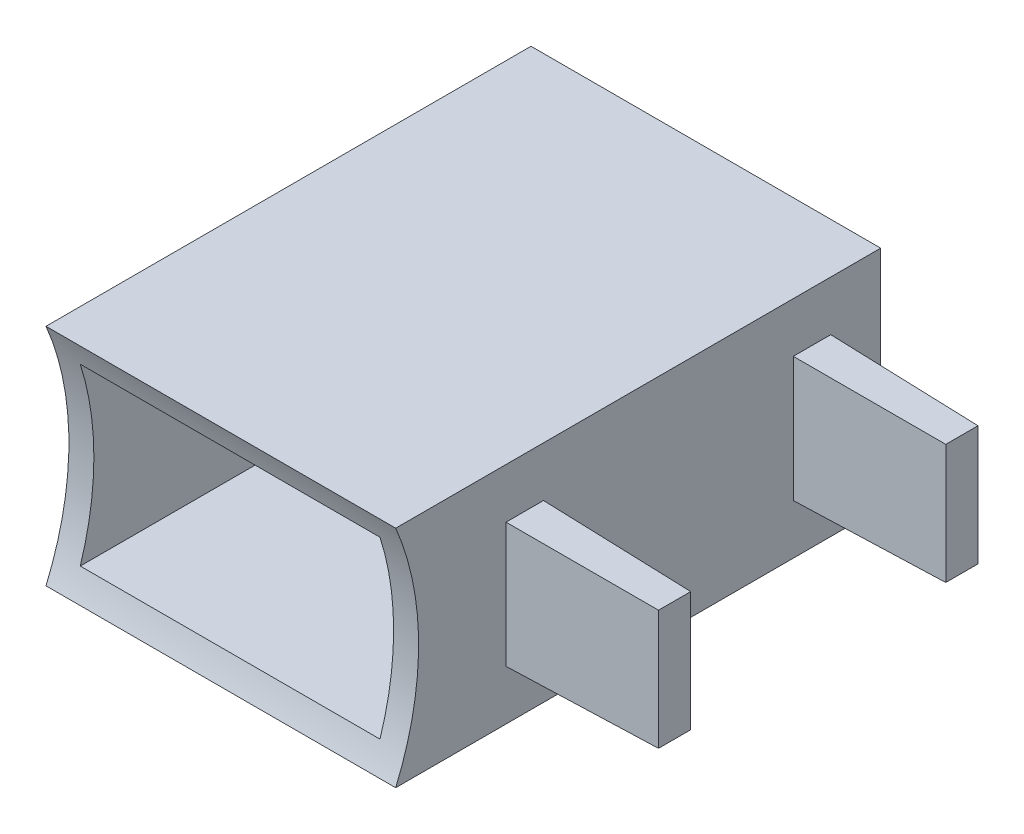
ISO-10303-21;
HEADER;
FILE_DESCRIPTION(('STEP AP214'),'2;1');
FILE_NAME('part.step','',(''),(''),'','','');
FILE_SCHEMA(('AUTOMOTIVE_DESIGN { 1 0 10303 214 1 1 1 1 }'));
ENDSEC;
DATA;
#1=APPLICATION_CONTEXT('core data for automotive mechanical design processes');
#2=APPLICATION_PROTOCOL_DEFINITION('international standard','automotive_design',2000,#1);
#3=PRODUCT_CONTEXT('',#1,'mechanical');
#4=PRODUCT('Part','Part','',(#3));
#5=PRODUCT_RELATED_PRODUCT_CATEGORY('part','',(#4));
#6=PRODUCT_DEFINITION_FORMATION('','',#4);
#7=PRODUCT_DEFINITION_CONTEXT('part definition',#1,'design');
#8=PRODUCT_DEFINITION('design','',#6,#7);
#9=PRODUCT_DEFINITION_SHAPE('','',#8);
#10=(LENGTH_UNIT() NAMED_UNIT(*) SI_UNIT(.MILLI.,.METRE.));
#11=(NAMED_UNIT(*) PLANE_ANGLE_UNIT() SI_UNIT($,.RADIAN.));
#12=(NAMED_UNIT(*) SI_UNIT($,.STERADIAN.) SOLID_ANGLE_UNIT());
#13=UNCERTAINTY_MEASURE_WITH_UNIT(LENGTH_MEASURE(1.E-05),#10,'distance_accuracy_value','');
#14=(GEOMETRIC_REPRESENTATION_CONTEXT(3) GLOBAL_UNCERTAINTY_ASSIGNED_CONTEXT((#13)) GLOBAL_UNIT_ASSIGNED_CONTEXT((#10,
#11,#12)) REPRESENTATION_CONTEXT('',''));
#15=CARTESIAN_POINT('',(0.,0.,0.));
#16=DIRECTION('',(0.,0.,1.));
#17=DIRECTION('',(1.,0.,0.));
#18=AXIS2_PLACEMENT_3D('',#15,#16,#17);
#19=CARTESIAN_POINT('',(7.,16.7915026221292,-4.70849737787081));
#20=DIRECTION('',(-1.,0.,0.));
#21=DIRECTION('',(0.,1.,0.));
#22=AXIS2_PLACEMENT_3D('',#19,#20,#21);
#23=PLANE('',#22);
#24=DIRECTION('',(0.,0.,-1.));
#25=VECTOR('',#24,1.);
#26=CARTESIAN_POINT('',(7.,17.7915026221292,-7.70849737787081));
#27=LINE('',#26,#25);
#28=CARTESIAN_POINT('',(7.,17.7915026221292,-6.20849737787081));
#29=VERTEX_POINT('',#28);
#30=CARTESIAN_POINT('',(7.,17.7915026221292,-7.70849737787081));
#31=VERTEX_POINT('',#30);
#32=EDGE_CURVE('E221',#29,#31,#27,.T.);
#33=ORIENTED_EDGE('',*,*,#32,.F.);
#34=DIRECTION('',(0.,-1.,0.));
#35=VECTOR('',#34,1.);
#36=CARTESIAN_POINT('',(7.,22.7915026221292,-6.20849737787083));
#37=LINE('',#36,#35);
#38=CARTESIAN_POINT('',(7.,22.7915026221292,-6.20849737787083));
#39=VERTEX_POINT('',#38);
#40=EDGE_CURVE('E233',#39,#29,#37,.T.);
#41=ORIENTED_EDGE('',*,*,#40,.F.);
#42=DIRECTION('',(0.,0.,1.));
#43=VECTOR('',#42,1.);
#44=CARTESIAN_POINT('',(7.,22.7915026221292,-7.70849737787083));
#45=LINE('',#44,#43);
#46=CARTESIAN_POINT('',(7.,22.7915026221292,-7.70849737787083));
#47=VERTEX_POINT('',#46);
#48=EDGE_CURVE('E229',#47,#39,#45,.T.);
#49=ORIENTED_EDGE('',*,*,#48,.F.);
#50=DIRECTION('',(0.,1.,0.));
#51=VECTOR('',#50,1.);
#52=CARTESIAN_POINT('',(7.,22.7915026221292,-7.70849737787083));
#53=LINE('',#52,#51);
#54=EDGE_CURVE('E225',#31,#47,#53,.T.);
#55=ORIENTED_EDGE('',*,*,#54,.F.);
#56=EDGE_LOOP('',(#33,#41,#49,#55));
#57=FACE_BOUND('',#56,.T.);
#58=DIRECTION('',(0.,0.,1.));
#59=VECTOR('',#58,1.);
#60=CARTESIAN_POINT('',(7.,24.7915026221292,-4.70849737787084));
#61=LINE('',#60,#59);
#62=CARTESIAN_POINT('',(7.,24.7915026221291,-9.70849737787084));
#63=VERTEX_POINT('',#62);
#64=CARTESIAN_POINT('',(7.,24.7915026221292,9.70849737787081));
#65=VERTEX_POINT('',#64);
#66=EDGE_CURVE('E323',#63,#65,#61,.T.);
#67=ORIENTED_EDGE('',*,*,#66,.T.);
#68=CARTESIAN_POINT('',(7.,20.2915026221293,20.2915026221292));
#69=DIRECTION('',(1.,0.,0.));
#70=DIRECTION('',(0.,-1.,0.));
#71=AXIS2_PLACEMENT_3D('',#68,#69,#70);
#72=CIRCLE('',#71,11.5);
#73=CARTESIAN_POINT('',(7.,15.7915026221292,9.70849737787084));
#74=VERTEX_POINT('',#73);
#75=EDGE_CURVE('E289',#74,#65,#72,.T.);
#76=ORIENTED_EDGE('',*,*,#75,.F.);
#77=DIRECTION('',(0.,0.,1.));
#78=VECTOR('',#77,1.);
#79=CARTESIAN_POINT('',(7.,15.7915026221292,-4.7084973778708));
#80=LINE('',#79,#78);
#81=CARTESIAN_POINT('',(7.,15.7915026221291,-9.7084973778708));
#82=VERTEX_POINT('',#81);
#83=EDGE_CURVE('E324',#82,#74,#80,.T.);
#84=ORIENTED_EDGE('',*,*,#83,.F.);
#85=DIRECTION('',(0.,-1.,0.));
#86=VECTOR('',#85,1.);
#87=CARTESIAN_POINT('',(7.,15.7915026221291,-9.7084973778708));
#88=LINE('',#87,#86);
#89=EDGE_CURVE('E267',#63,#82,#88,.T.);
#90=ORIENTED_EDGE('',*,*,#89,.F.);
#91=EDGE_LOOP('',(#67,#76,#84,#90));
#92=FACE_BOUND('',#91,.T.);
#93=DIRECTION('',(0.,0.,-1.));
#94=VECTOR('',#93,1.);
#95=CARTESIAN_POINT('',(7.,17.7915026221292,3.79150262212919));
#96=LINE('',#95,#94);
#97=CARTESIAN_POINT('',(7.,17.7915026221292,5.29150262212919));
#98=VERTEX_POINT('',#97);
#99=CARTESIAN_POINT('',(7.,17.7915026221292,3.79150262212919));
#100=VERTEX_POINT('',#99);
#101=EDGE_CURVE('E218',#98,#100,#96,.T.);
#102=ORIENTED_EDGE('',*,*,#101,.F.);
#103=DIRECTION('',(0.,-1.,0.));
#104=VECTOR('',#103,1.);
#105=CARTESIAN_POINT('',(7.,22.7915026221292,5.29150262212917));
#106=LINE('',#105,#104);
#107=CARTESIAN_POINT('',(7.,22.7915026221292,5.29150262212917));
#108=VERTEX_POINT('',#107);
#109=EDGE_CURVE('E189',#108,#98,#106,.T.);
#110=ORIENTED_EDGE('',*,*,#109,.F.);
#111=DIRECTION('',(0.,0.,1.));
#112=VECTOR('',#111,1.);
#113=CARTESIAN_POINT('',(7.,22.7915026221292,3.79150262212917));
#114=LINE('',#113,#112);
#115=CARTESIAN_POINT('',(7.,22.7915026221292,3.79150262212917));
#116=VERTEX_POINT('',#115);
#117=EDGE_CURVE('E70',#116,#108,#114,.T.);
#118=ORIENTED_EDGE('',*,*,#117,.F.);
#119=DIRECTION('',(0.,1.,0.));
#120=VECTOR('',#119,1.);
#121=CARTESIAN_POINT('',(7.,22.7915026221292,3.79150262212917));
#122=LINE('',#121,#120);
#123=EDGE_CURVE('E65',#100,#116,#122,.T.);
#124=ORIENTED_EDGE('',*,*,#123,.F.);
#125=EDGE_LOOP('',(#102,#110,#118,#124));
#126=FACE_BOUND('',#125,.T.);
#127=ADVANCED_FACE('F46',(#57,#92,#126),#23,.F.);
#128=CARTESIAN_POINT('',(-6.,15.7915026221292,-4.7084973778708));
#129=DIRECTION('',(0.,1.,0.));
#130=DIRECTION('',(1.,0.,0.));
#131=AXIS2_PLACEMENT_3D('',#128,#129,#130);
#132=PLANE('',#131);
#133=ORIENTED_EDGE('',*,*,#83,.T.);
#134=DIRECTION('',(1.,0.,0.));
#135=VECTOR('',#134,1.);
#136=CARTESIAN_POINT('',(-7.001,15.7915026221292,9.70849737787084));
#137=LINE('',#136,#135);
#138=CARTESIAN_POINT('',(-7.,15.7915026221292,9.70849737787084));
#139=VERTEX_POINT('',#138);
#140=EDGE_CURVE('E286',#139,#74,#137,.T.);
#141=ORIENTED_EDGE('',*,*,#140,.F.);
#142=DIRECTION('',(0.,0.,1.));
#143=VECTOR('',#142,1.);
#144=CARTESIAN_POINT('',(-7.,15.7915026221292,-4.7084973778708));
#145=LINE('',#144,#143);
#146=CARTESIAN_POINT('',(-7.,15.7915026221291,-9.7084973778708));
#147=VERTEX_POINT('',#146);
#148=EDGE_CURVE('E329',#147,#139,#145,.T.);
#149=ORIENTED_EDGE('',*,*,#148,.F.);
#150=DIRECTION('',(-1.,0.,0.));
#151=VECTOR('',#150,1.);
#152=CARTESIAN_POINT('',(-7.,15.7915026221291,-9.7084973778708));
#153=LINE('',#152,#151);
#154=EDGE_CURVE('E271',#82,#147,#153,.T.);
#155=ORIENTED_EDGE('',*,*,#154,.F.);
#156=EDGE_LOOP('',(#133,#141,#149,#155));
#157=FACE_BOUND('',#156,.T.);
#158=ADVANCED_FACE('F421',(#157),#132,.F.);
#159=CARTESIAN_POINT('',(-7.,16.7915026221292,-4.70849737787081));
#160=DIRECTION('',(1.,0.,0.));
#161=DIRECTION('',(0.,-1.,0.));
#162=AXIS2_PLACEMENT_3D('',#159,#160,#161);
#163=PLANE('',#162);
#164=ORIENTED_EDGE('',*,*,#148,.T.);
#165=CARTESIAN_POINT('',(-6.99999999999999,20.2915026221293,20.2915026221292));
#166=DIRECTION('',(1.,0.,0.));
#167=DIRECTION('',(0.,-1.,0.));
#168=AXIS2_PLACEMENT_3D('',#165,#166,#167);
#169=CIRCLE('',#168,11.5);
#170=CARTESIAN_POINT('',(-6.99999999999999,24.7915026221292,9.70849737787081));
#171=VERTEX_POINT('',#170);
#172=EDGE_CURVE('E308',#171,#139,#169,.F.);
#173=ORIENTED_EDGE('',*,*,#172,.F.);
#174=DIRECTION('',(0.,0.,1.));
#175=VECTOR('',#174,1.);
#176=CARTESIAN_POINT('',(-6.99999999999999,24.7915026221292,-4.70849737787084));
#177=LINE('',#176,#175);
#178=CARTESIAN_POINT('',(-7.,24.7915026221291,-9.70849737787084));
#179=VERTEX_POINT('',#178);
#180=EDGE_CURVE('E333',#179,#171,#177,.T.);
#181=ORIENTED_EDGE('',*,*,#180,.F.);
#182=DIRECTION('',(0.,1.,0.));
#183=VECTOR('',#182,1.);
#184=CARTESIAN_POINT('',(-7.,15.7915026221291,-9.7084973778708));
#185=LINE('',#184,#183);
#186=EDGE_CURVE('E275',#147,#179,#185,.T.);
#187=ORIENTED_EDGE('',*,*,#186,.F.);
#188=EDGE_LOOP('',(#164,#173,#181,#187));
#189=FACE_BOUND('',#188,.T.);
#190=ADVANCED_FACE('F427',(#189),#163,.F.);
#191=CARTESIAN_POINT('',(-5.99999999999999,24.7915026221292,-4.70849737787084));
#192=DIRECTION('',(0.,-1.,0.));
#193=DIRECTION('',(-1.,0.,0.));
#194=AXIS2_PLACEMENT_3D('',#191,#192,#193);
#195=PLANE('',#194);
#196=ORIENTED_EDGE('',*,*,#180,.T.);
#197=DIRECTION('',(1.,0.,0.));
#198=VECTOR('',#197,1.);
#199=CARTESIAN_POINT('',(-7.001,24.7915026221292,9.70849737787081));
#200=LINE('',#199,#198);
#201=EDGE_CURVE('E283',#65,#171,#200,.F.);
#202=ORIENTED_EDGE('',*,*,#201,.F.);
#203=ORIENTED_EDGE('',*,*,#66,.F.);
#204=DIRECTION('',(1.,0.,0.));
#205=VECTOR('',#204,1.);
#206=CARTESIAN_POINT('',(-7.,24.7915026221291,-9.70849737787084));
#207=LINE('',#206,#205);
#208=EDGE_CURVE('E279',#179,#63,#207,.T.);
#209=ORIENTED_EDGE('',*,*,#208,.F.);
#210=EDGE_LOOP('',(#196,#202,#203,#209));
#211=FACE_BOUND('',#210,.T.);
#212=ADVANCED_FACE('F418',(#211),#195,.F.);
#213=CARTESIAN_POINT('',(6.,16.7915026221292,-4.70849737787081));
#214=DIRECTION('',(-1.,0.,0.));
#215=DIRECTION('',(0.,1.,0.));
#216=AXIS2_PLACEMENT_3D('',#213,#214,#215);
#217=PLANE('',#216);
#218=DIRECTION('',(0.,0.,1.));
#219=VECTOR('',#218,1.);
#220=CARTESIAN_POINT('',(6.,23.7915026221292,-4.70849737787083));
#221=LINE('',#220,#219);
#222=CARTESIAN_POINT('',(6.,23.7915026221292,-8.8424719740864));
#223=VERTEX_POINT('',#222);
#224=CARTESIAN_POINT('',(6.,23.7915026221292,9.33705147202585));
#225=VERTEX_POINT('',#224);
#226=EDGE_CURVE('E311',#223,#225,#221,.T.);
#227=ORIENTED_EDGE('',*,*,#226,.F.);
#228=DIRECTION('',(0.,-1.,0.));
#229=VECTOR('',#228,1.);
#230=CARTESIAN_POINT('',(6.,16.7915026221292,-8.84247197408637));
#231=LINE('',#230,#229);
#232=CARTESIAN_POINT('',(6.,16.7915026221292,-8.84247197408637));
#233=VERTEX_POINT('',#232);
#234=EDGE_CURVE('E57',#223,#233,#231,.T.);
#235=ORIENTED_EDGE('',*,*,#234,.T.);
#236=DIRECTION('',(0.,0.,1.));
#237=VECTOR('',#236,1.);
#238=CARTESIAN_POINT('',(6.,16.7915026221292,-4.70849737787081));
#239=LINE('',#238,#237);
#240=CARTESIAN_POINT('',(6.,16.7915026221292,9.33705147202587));
#241=VERTEX_POINT('',#240);
#242=EDGE_CURVE('E320',#233,#241,#239,.T.);
#243=ORIENTED_EDGE('',*,*,#242,.T.);
#244=CARTESIAN_POINT('',(6.,20.2915026221293,20.2915026221292));
#245=DIRECTION('',(-1.,0.,0.));
#246=DIRECTION('',(0.,1.,0.));
#247=AXIS2_PLACEMENT_3D('',#244,#245,#246);
#248=CIRCLE('',#247,11.5);
#249=EDGE_CURVE('E304',#241,#225,#248,.F.);
#250=ORIENTED_EDGE('',*,*,#249,.T.);
#251=EDGE_LOOP('',(#227,#235,#243,#250));
#252=FACE_BOUND('',#251,.T.);
#253=ADVANCED_FACE('F407',(#252),#217,.T.);
#254=CARTESIAN_POINT('',(-6.,16.7915026221292,-4.70849737787081));
#255=DIRECTION('',(0.,1.,0.));
#256=DIRECTION('',(1.,0.,0.));
#257=AXIS2_PLACEMENT_3D('',#254,#255,#256);
#258=PLANE('',#257);
#259=ORIENTED_EDGE('',*,*,#242,.F.);
#260=DIRECTION('',(-1.,0.,0.));
#261=VECTOR('',#260,1.);
#262=CARTESIAN_POINT('',(-6.,16.7915026221292,-8.84247197408637));
#263=LINE('',#262,#261);
#264=CARTESIAN_POINT('',(-6.,16.7915026221292,-8.84247197408637));
#265=VERTEX_POINT('',#264);
#266=EDGE_CURVE('E11',#233,#265,#263,.T.);
#267=ORIENTED_EDGE('',*,*,#266,.T.);
#268=DIRECTION('',(0.,0.,1.));
#269=VECTOR('',#268,1.);
#270=CARTESIAN_POINT('',(-6.,16.7915026221292,-4.70849737787081));
#271=LINE('',#270,#269);
#272=CARTESIAN_POINT('',(-6.,16.7915026221292,9.33705147202588));
#273=VERTEX_POINT('',#272);
#274=EDGE_CURVE('E317',#265,#273,#271,.T.);
#275=ORIENTED_EDGE('',*,*,#274,.T.);
#276=DIRECTION('',(1.,0.,0.));
#277=VECTOR('',#276,1.);
#278=CARTESIAN_POINT('',(-7.001,16.7915026221292,9.33705147202587));
#279=LINE('',#278,#277);
#280=EDGE_CURVE('E300',#273,#241,#279,.T.);
#281=ORIENTED_EDGE('',*,*,#280,.T.);
#282=EDGE_LOOP('',(#259,#267,#275,#281));
#283=FACE_BOUND('',#282,.T.);
#284=ADVANCED_FACE('F410',(#283),#258,.T.);
#285=CARTESIAN_POINT('',(-6.,16.7915026221292,-4.70849737787081));
#286=DIRECTION('',(1.,0.,0.));
#287=DIRECTION('',(0.,-1.,0.));
#288=AXIS2_PLACEMENT_3D('',#285,#286,#287);
#289=PLANE('',#288);
#290=ORIENTED_EDGE('',*,*,#274,.F.);
#291=DIRECTION('',(0.,1.,0.));
#292=VECTOR('',#291,1.);
#293=CARTESIAN_POINT('',(-6.,16.7915026221292,-8.84247197408637));
#294=LINE('',#293,#292);
#295=CARTESIAN_POINT('',(-5.99999999999999,23.7915026221292,-8.8424719740864));
#296=VERTEX_POINT('',#295);
#297=EDGE_CURVE('E328',#265,#296,#294,.T.);
#298=ORIENTED_EDGE('',*,*,#297,.T.);
#299=DIRECTION('',(0.,0.,1.));
#300=VECTOR('',#299,1.);
#301=CARTESIAN_POINT('',(-5.99999999999999,23.7915026221292,-4.70849737787083));
#302=LINE('',#301,#300);
#303=CARTESIAN_POINT('',(-5.99999999999999,23.7915026221292,9.33705147202585));
#304=VERTEX_POINT('',#303);
#305=EDGE_CURVE('E314',#296,#304,#302,.T.);
#306=ORIENTED_EDGE('',*,*,#305,.T.);
#307=CARTESIAN_POINT('',(-6.,20.2915026221293,20.2915026221292));
#308=DIRECTION('',(1.,0.,0.));
#309=DIRECTION('',(0.,-1.,0.));
#310=AXIS2_PLACEMENT_3D('',#307,#308,#309);
#311=CIRCLE('',#310,11.5);
#312=EDGE_CURVE('E296',#304,#273,#311,.F.);
#313=ORIENTED_EDGE('',*,*,#312,.T.);
#314=EDGE_LOOP('',(#290,#298,#306,#313));
#315=FACE_BOUND('',#314,.T.);
#316=ADVANCED_FACE('F397',(#315),#289,.T.);
#317=CARTESIAN_POINT('',(-5.99999999999999,23.7915026221292,-4.70849737787083));
#318=DIRECTION('',(0.,-1.,0.));
#319=DIRECTION('',(-1.,0.,0.));
#320=AXIS2_PLACEMENT_3D('',#317,#318,#319);
#321=PLANE('',#320);
#322=ORIENTED_EDGE('',*,*,#305,.F.);
#323=DIRECTION('',(1.,0.,0.));
#324=VECTOR('',#323,1.);
#325=CARTESIAN_POINT('',(-5.99999999999999,23.7915026221292,-8.8424719740864));
#326=LINE('',#325,#324);
#327=EDGE_CURVE('E356',#296,#223,#326,.T.);
#328=ORIENTED_EDGE('',*,*,#327,.T.);
#329=ORIENTED_EDGE('',*,*,#226,.T.);
#330=DIRECTION('',(1.,0.,0.));
#331=VECTOR('',#330,1.);
#332=CARTESIAN_POINT('',(-7.001,23.7915026221292,9.33705147202585));
#333=LINE('',#332,#331);
#334=EDGE_CURVE('E292',#225,#304,#333,.F.);
#335=ORIENTED_EDGE('',*,*,#334,.T.);
#336=EDGE_LOOP('',(#322,#328,#329,#335));
#337=FACE_BOUND('',#336,.T.);
#338=ADVANCED_FACE('F399',(#337),#321,.T.);
#339=CARTESIAN_POINT('',(-7.001,20.2915026221293,20.2915026221292));
#340=DIRECTION('',(1.,0.,0.));
#341=DIRECTION('',(0.,-1.,0.));
#342=AXIS2_PLACEMENT_3D('',#339,#340,#341);
#343=CYLINDRICAL_SURFACE('',#342,11.5);
#344=ORIENTED_EDGE('',*,*,#280,.F.);
#345=ORIENTED_EDGE('',*,*,#312,.F.);
#346=ORIENTED_EDGE('',*,*,#334,.F.);
#347=ORIENTED_EDGE('',*,*,#249,.F.);
#348=EDGE_LOOP('',(#344,#345,#346,#347));
#349=FACE_BOUND('',#348,.T.);
#350=ORIENTED_EDGE('',*,*,#140,.T.);
#351=ORIENTED_EDGE('',*,*,#75,.T.);
#352=ORIENTED_EDGE('',*,*,#201,.T.);
#353=ORIENTED_EDGE('',*,*,#172,.T.);
#354=EDGE_LOOP('',(#350,#351,#352,#353));
#355=FACE_BOUND('',#354,.T.);
#356=ADVANCED_FACE('F404',(#349,#355),#343,.F.);
#357=CARTESIAN_POINT('',(0.,20.2915026221292,-9.70849737787082));
#358=DIRECTION('',(0.,0.,-1.));
#359=DIRECTION('',(0.,1.,0.));
#360=AXIS2_PLACEMENT_3D('',#357,#358,#359);
#361=PLANE('',#360);
#362=DIRECTION('',(-1.,0.,0.));
#363=VECTOR('',#362,1.);
#364=CARTESIAN_POINT('',(0.,24.2915026221292,-9.70849737787083));
#365=LINE('',#364,#363);
#366=CARTESIAN_POINT('',(6.5,24.2915026221292,-9.70849737787083));
#367=VERTEX_POINT('',#366);
#368=CARTESIAN_POINT('',(-6.5,24.2915026221292,-9.70849737787083));
#369=VERTEX_POINT('',#368);
#370=EDGE_CURVE('E349',#367,#369,#365,.T.);
#371=ORIENTED_EDGE('',*,*,#370,.T.);
#372=DIRECTION('',(0.,-1.,0.));
#373=VECTOR('',#372,1.);
#374=CARTESIAN_POINT('',(-6.5,20.2915026221292,-9.70849737787082));
#375=LINE('',#374,#373);
#376=CARTESIAN_POINT('',(-6.5,16.2915026221291,-9.70849737787081));
#377=VERTEX_POINT('',#376);
#378=EDGE_CURVE('E352',#369,#377,#375,.T.);
#379=ORIENTED_EDGE('',*,*,#378,.T.);
#380=DIRECTION('',(1.,0.,0.));
#381=VECTOR('',#380,1.);
#382=CARTESIAN_POINT('',(0.,16.2915026221291,-9.70849737787081));
#383=LINE('',#382,#381);
#384=CARTESIAN_POINT('',(6.5,16.2915026221291,-9.70849737787081));
#385=VERTEX_POINT('',#384);
#386=EDGE_CURVE('E343',#377,#385,#383,.T.);
#387=ORIENTED_EDGE('',*,*,#386,.T.);
#388=DIRECTION('',(0.,1.,0.));
#389=VECTOR('',#388,1.);
#390=CARTESIAN_POINT('',(6.5,20.2915026221292,-9.70849737787082));
#391=LINE('',#390,#389);
#392=EDGE_CURVE('E346',#385,#367,#391,.T.);
#393=ORIENTED_EDGE('',*,*,#392,.T.);
#394=EDGE_LOOP('',(#371,#379,#387,#393));
#395=FACE_BOUND('',#394,.T.);
#396=ORIENTED_EDGE('',*,*,#89,.T.);
#397=ORIENTED_EDGE('',*,*,#154,.T.);
#398=ORIENTED_EDGE('',*,*,#186,.T.);
#399=ORIENTED_EDGE('',*,*,#208,.T.);
#400=EDGE_LOOP('',(#396,#397,#398,#399));
#401=FACE_BOUND('',#400,.T.);
#402=ADVANCED_FACE('F384',(#395,#401),#361,.T.);
#403=CARTESIAN_POINT('',(6.,16.7915026221292,-8.84247197408637));
#404=DIRECTION('',(0.866025403784437,0.,0.500000000000003));
#405=DIRECTION('',(0.,-1.,0.));
#406=AXIS2_PLACEMENT_3D('',#403,#404,#405);
#407=PLANE('',#406);
#408=DIRECTION('',(0.44721359549996,0.447213595499957,-0.774596669241483));
#409=VECTOR('',#408,1.);
#410=CARTESIAN_POINT('',(3.59999999999998,21.3915026221291,-4.68555003592108));
#411=LINE('',#410,#409);
#412=EDGE_CURVE('E365',#367,#223,#411,.F.);
#413=ORIENTED_EDGE('',*,*,#412,.F.);
#414=ORIENTED_EDGE('',*,*,#392,.F.);
#415=DIRECTION('',(0.44721359549996,-0.447213595499963,-0.77459666924148));
#416=VECTOR('',#415,1.);
#417=CARTESIAN_POINT('',(6.,16.7915026221292,-8.84247197408637));
#418=LINE('',#417,#416);
#419=EDGE_CURVE('E51',#233,#385,#418,.T.);
#420=ORIENTED_EDGE('',*,*,#419,.F.);
#421=ORIENTED_EDGE('',*,*,#234,.F.);
#422=EDGE_LOOP('',(#413,#414,#420,#421));
#423=FACE_BOUND('',#422,.T.);
#424=ADVANCED_FACE('F49',(#423),#407,.F.);
#425=CARTESIAN_POINT('',(-6.,16.7915026221292,-8.84247197408637));
#426=DIRECTION('',(0.,-0.866025403784435,0.500000000000006));
#427=DIRECTION('',(-1.,0.,0.));
#428=AXIS2_PLACEMENT_3D('',#425,#426,#427);
#429=PLANE('',#428);
#430=ORIENTED_EDGE('',*,*,#419,.T.);
#431=ORIENTED_EDGE('',*,*,#386,.F.);
#432=DIRECTION('',(0.44721359549996,0.447213595499963,0.77459666924148));
#433=VECTOR('',#432,1.);
#434=CARTESIAN_POINT('',(-6.,16.7915026221292,-8.84247197408637));
#435=LINE('',#434,#433);
#436=EDGE_CURVE('E363',#265,#377,#435,.F.);
#437=ORIENTED_EDGE('',*,*,#436,.F.);
#438=ORIENTED_EDGE('',*,*,#266,.F.);
#439=EDGE_LOOP('',(#430,#431,#437,#438));
#440=FACE_BOUND('',#439,.T.);
#441=ADVANCED_FACE('F378',(#440),#429,.F.);
#442=CARTESIAN_POINT('',(-5.99999999999999,23.7915026221292,-8.8424719740864));
#443=DIRECTION('',(0.,0.866025403784439,0.5));
#444=DIRECTION('',(1.,0.,0.));
#445=AXIS2_PLACEMENT_3D('',#442,#443,#444);
#446=PLANE('',#445);
#447=ORIENTED_EDGE('',*,*,#412,.T.);
#448=ORIENTED_EDGE('',*,*,#327,.F.);
#449=DIRECTION('',(-0.44721359549996,0.447213595499957,-0.774596669241483));
#450=VECTOR('',#449,1.);
#451=CARTESIAN_POINT('',(-4.59999999999998,22.3915026221291,-6.41760084348996));
#452=LINE('',#451,#450);
#453=EDGE_CURVE('E242',#369,#296,#452,.F.);
#454=ORIENTED_EDGE('',*,*,#453,.F.);
#455=ORIENTED_EDGE('',*,*,#370,.F.);
#456=EDGE_LOOP('',(#447,#448,#454,#455));
#457=FACE_BOUND('',#456,.T.);
#458=ADVANCED_FACE('F391',(#457),#446,.F.);
#459=CARTESIAN_POINT('',(-6.,16.7915026221292,-8.84247197408637));
#460=DIRECTION('',(-0.866025403784437,0.,0.500000000000003));
#461=DIRECTION('',(0.,1.,0.));
#462=AXIS2_PLACEMENT_3D('',#459,#460,#461);
#463=PLANE('',#462);
#464=ORIENTED_EDGE('',*,*,#436,.T.);
#465=ORIENTED_EDGE('',*,*,#378,.F.);
#466=ORIENTED_EDGE('',*,*,#453,.T.);
#467=ORIENTED_EDGE('',*,*,#297,.F.);
#468=EDGE_LOOP('',(#464,#465,#466,#467));
#469=FACE_BOUND('',#468,.T.);
#470=ADVANCED_FACE('F389',(#469),#463,.F.);
#471=CARTESIAN_POINT('',(7.,17.7915026221292,-7.70849737787081));
#472=DIRECTION('',(0.0174524064372838,-0.999847695156391,0.));
#473=DIRECTION('',(-0.999847695156391,-0.0174524064372838,0.));
#474=AXIS2_PLACEMENT_3D('',#471,#472,#473);
#475=PLANE('',#474);
#476=ORIENTED_EDGE('',*,*,#32,.T.);
#477=DIRECTION('',(-0.999695459881887,-0.017449749160683,-0.0174497491606827));
#478=VECTOR('',#477,1.);
#479=CARTESIAN_POINT('',(7.08722217506006,17.793025090858,-7.70697490914196));
#480=LINE('',#479,#478);
#481=CARTESIAN_POINT('',(13.,17.8962330116985,-7.60376698830151));
#482=VERTEX_POINT('',#481);
#483=EDGE_CURVE('E238',#482,#31,#480,.T.);
#484=ORIENTED_EDGE('',*,*,#483,.F.);
#485=DIRECTION('',(0.,0.,1.));
#486=VECTOR('',#485,1.);
#487=CARTESIAN_POINT('',(13.,17.8962330116985,-7.70849737787082));
#488=LINE('',#487,#486);
#489=CARTESIAN_POINT('',(13.,17.8962330116985,-6.31322776744012));
#490=VERTEX_POINT('',#489);
#491=EDGE_CURVE('E237',#490,#482,#488,.F.);
#492=ORIENTED_EDGE('',*,*,#491,.F.);
#493=DIRECTION('',(-0.999695459881887,-0.0174497491606829,0.0174497491606828));
#494=VECTOR('',#493,1.);
#495=CARTESIAN_POINT('',(7.02616665251802,17.7919593627478,-6.20895411848947));
#496=LINE('',#495,#494);
#497=EDGE_CURVE('E244',#490,#29,#496,.T.);
#498=ORIENTED_EDGE('',*,*,#497,.T.);
#499=EDGE_LOOP('',(#476,#484,#492,#498));
#500=FACE_BOUND('',#499,.T.);
#501=ADVANCED_FACE('F444',(#500),#475,.T.);
#502=CARTESIAN_POINT('',(7.,22.7915026221292,-7.70849737787083));
#503=DIRECTION('',(0.0174524064372835,0.,-0.999847695156391));
#504=DIRECTION('',(-0.999847695156391,0.,-0.0174524064372835));
#505=AXIS2_PLACEMENT_3D('',#502,#503,#504);
#506=PLANE('',#505);
#507=ORIENTED_EDGE('',*,*,#54,.T.);
#508=DIRECTION('',(-0.999695459881887,0.0174497491606824,-0.0174497491606828));
#509=VECTOR('',#508,1.);
#510=CARTESIAN_POINT('',(7.,22.7915026221292,-7.70849737787083));
#511=LINE('',#510,#509);
#512=CARTESIAN_POINT('',(13.,22.6867722325599,-7.60376698830153));
#513=VERTEX_POINT('',#512);
#514=EDGE_CURVE('E243',#513,#47,#511,.T.);
#515=ORIENTED_EDGE('',*,*,#514,.F.);
#516=DIRECTION('',(0.,-1.,0.));
#517=VECTOR('',#516,1.);
#518=CARTESIAN_POINT('',(13.,22.7915026221292,-7.60376698830153));
#519=LINE('',#518,#517);
#520=EDGE_CURVE('E259',#482,#513,#519,.F.);
#521=ORIENTED_EDGE('',*,*,#520,.F.);
#522=ORIENTED_EDGE('',*,*,#483,.T.);
#523=EDGE_LOOP('',(#507,#515,#521,#522));
#524=FACE_BOUND('',#523,.T.);
#525=ADVANCED_FACE('F464',(#524),#506,.T.);
#526=CARTESIAN_POINT('',(7.,22.7915026221292,-7.70849737787083));
#527=DIRECTION('',(0.0174524064372833,0.999847695156391,0.));
#528=DIRECTION('',(0.999847695156391,-0.0174524064372833,0.));
#529=AXIS2_PLACEMENT_3D('',#526,#527,#528);
#530=PLANE('',#529);
#531=ORIENTED_EDGE('',*,*,#48,.T.);
#532=DIRECTION('',(-0.999695459881887,0.0174497491606825,0.0174497491606827));
#533=VECTOR('',#532,1.);
#534=CARTESIAN_POINT('',(7.,22.7915026221292,-6.20849737787083));
#535=LINE('',#534,#533);
#536=CARTESIAN_POINT('',(13.,22.6867722325599,-6.31322776744013));
#537=VERTEX_POINT('',#536);
#538=EDGE_CURVE('E248',#537,#39,#535,.T.);
#539=ORIENTED_EDGE('',*,*,#538,.F.);
#540=DIRECTION('',(0.,0.,-1.));
#541=VECTOR('',#540,1.);
#542=CARTESIAN_POINT('',(13.,22.6867722325599,-7.70849737787083));
#543=LINE('',#542,#541);
#544=EDGE_CURVE('E262',#513,#537,#543,.F.);
#545=ORIENTED_EDGE('',*,*,#544,.F.);
#546=ORIENTED_EDGE('',*,*,#514,.T.);
#547=EDGE_LOOP('',(#531,#539,#545,#546));
#548=FACE_BOUND('',#547,.T.);
#549=ADVANCED_FACE('F573',(#548),#530,.T.);
#550=CARTESIAN_POINT('',(7.,22.7915026221292,-6.20849737787083));
#551=DIRECTION('',(0.0174524064372835,0.,0.999847695156391));
#552=DIRECTION('',(0.999847695156391,0.,-0.0174524064372835));
#553=AXIS2_PLACEMENT_3D('',#550,#551,#552);
#554=PLANE('',#553);
#555=ORIENTED_EDGE('',*,*,#40,.T.);
#556=ORIENTED_EDGE('',*,*,#497,.F.);
#557=DIRECTION('',(0.,1.,0.));
#558=VECTOR('',#557,1.);
#559=CARTESIAN_POINT('',(13.,22.7915026221292,-6.31322776744014));
#560=LINE('',#559,#558);
#561=EDGE_CURVE('E249',#537,#490,#560,.F.);
#562=ORIENTED_EDGE('',*,*,#561,.F.);
#563=ORIENTED_EDGE('',*,*,#538,.T.);
#564=EDGE_LOOP('',(#555,#556,#562,#563));
#565=FACE_BOUND('',#564,.T.);
#566=ADVANCED_FACE('F580',(#565),#554,.T.);
#567=CARTESIAN_POINT('',(13.,20.2915026221293,20.2915026221292));
#568=DIRECTION('',(1.,0.,0.));
#569=DIRECTION('',(0.,-1.,0.));
#570=AXIS2_PLACEMENT_3D('',#567,#568,#569);
#571=PLANE('',#570);
#572=ORIENTED_EDGE('',*,*,#491,.T.);
#573=ORIENTED_EDGE('',*,*,#520,.T.);
#574=ORIENTED_EDGE('',*,*,#544,.T.);
#575=ORIENTED_EDGE('',*,*,#561,.T.);
#576=EDGE_LOOP('',(#572,#573,#574,#575));
#577=FACE_BOUND('',#576,.T.);
#578=ADVANCED_FACE('F587',(#577),#571,.T.);
#579=CARTESIAN_POINT('',(7.,17.7915026221292,3.79150262212919));
#580=DIRECTION('',(0.0174524064372838,-0.999847695156391,0.));
#581=DIRECTION('',(-0.999847695156391,-0.0174524064372838,0.));
#582=AXIS2_PLACEMENT_3D('',#579,#580,#581);
#583=PLANE('',#582);
#584=ORIENTED_EDGE('',*,*,#101,.T.);
#585=DIRECTION('',(-0.999695459881887,-0.017449749160683,-0.0174497491606827));
#586=VECTOR('',#585,1.);
#587=CARTESIAN_POINT('',(7.08722217506006,17.7930250908581,3.79302509085805));
#588=LINE('',#587,#586);
#589=CARTESIAN_POINT('',(13.,17.8962330116985,3.89623301169849));
#590=VERTEX_POINT('',#589);
#591=EDGE_CURVE('E196',#590,#100,#588,.T.);
#592=ORIENTED_EDGE('',*,*,#591,.F.);
#593=DIRECTION('',(0.,0.,1.));
#594=VECTOR('',#593,1.);
#595=CARTESIAN_POINT('',(13.,17.8962330116985,3.79150262212919));
#596=LINE('',#595,#594);
#597=CARTESIAN_POINT('',(13.,17.8962330116985,5.18677223255988));
#598=VERTEX_POINT('',#597);
#599=EDGE_CURVE('E176',#598,#590,#596,.F.);
#600=ORIENTED_EDGE('',*,*,#599,.F.);
#601=DIRECTION('',(-0.999695459881887,-0.0174497491606829,0.0174497491606828));
#602=VECTOR('',#601,1.);
#603=CARTESIAN_POINT('',(7.02616665251802,17.7919593627479,5.29104588151053));
#604=LINE('',#603,#602);
#605=EDGE_CURVE('E184',#598,#98,#604,.T.);
#606=ORIENTED_EDGE('',*,*,#605,.T.);
#607=EDGE_LOOP('',(#584,#592,#600,#606));
#608=FACE_BOUND('',#607,.T.);
#609=ADVANCED_FACE('F195',(#608),#583,.T.);
#610=CARTESIAN_POINT('',(7.,22.7915026221292,3.79150262212917));
#611=DIRECTION('',(0.0174524064372835,0.,-0.999847695156391));
#612=DIRECTION('',(-0.999847695156391,0.,-0.0174524064372835));
#613=AXIS2_PLACEMENT_3D('',#610,#611,#612);
#614=PLANE('',#613);
#615=ORIENTED_EDGE('',*,*,#123,.T.);
#616=DIRECTION('',(-0.999695459881887,0.0174497491606824,-0.0174497491606828));
#617=VECTOR('',#616,1.);
#618=CARTESIAN_POINT('',(7.,22.7915026221292,3.79150262212917));
#619=LINE('',#618,#617);
#620=CARTESIAN_POINT('',(13.,22.6867722325599,3.89623301169848));
#621=VERTEX_POINT('',#620);
#622=EDGE_CURVE('E206',#621,#116,#619,.T.);
#623=ORIENTED_EDGE('',*,*,#622,.F.);
#624=DIRECTION('',(0.,-1.,0.));
#625=VECTOR('',#624,1.);
#626=CARTESIAN_POINT('',(13.,22.7915026221292,3.89623301169847));
#627=LINE('',#626,#625);
#628=EDGE_CURVE('E198',#590,#621,#627,.F.);
#629=ORIENTED_EDGE('',*,*,#628,.F.);
#630=ORIENTED_EDGE('',*,*,#591,.T.);
#631=EDGE_LOOP('',(#615,#623,#629,#630));
#632=FACE_BOUND('',#631,.T.);
#633=ADVANCED_FACE('F602',(#632),#614,.T.);
#634=CARTESIAN_POINT('',(7.,22.7915026221292,3.79150262212917));
#635=DIRECTION('',(0.0174524064372833,0.999847695156391,0.));
#636=DIRECTION('',(0.999847695156391,-0.0174524064372833,0.));
#637=AXIS2_PLACEMENT_3D('',#634,#635,#636);
#638=PLANE('',#637);
#639=ORIENTED_EDGE('',*,*,#117,.T.);
#640=DIRECTION('',(-0.999695459881887,0.0174497491606825,0.0174497491606827));
#641=VECTOR('',#640,1.);
#642=CARTESIAN_POINT('',(7.,22.7915026221292,5.29150262212917));
#643=LINE('',#642,#641);
#644=CARTESIAN_POINT('',(13.,22.6867722325599,5.18677223255987));
#645=VERTEX_POINT('',#644);
#646=EDGE_CURVE('E193',#645,#108,#643,.T.);
#647=ORIENTED_EDGE('',*,*,#646,.F.);
#648=DIRECTION('',(0.,0.,-1.));
#649=VECTOR('',#648,1.);
#650=CARTESIAN_POINT('',(13.,22.6867722325599,3.79150262212917));
#651=LINE('',#650,#649);
#652=EDGE_CURVE('E179',#621,#645,#651,.F.);
#653=ORIENTED_EDGE('',*,*,#652,.F.);
#654=ORIENTED_EDGE('',*,*,#622,.T.);
#655=EDGE_LOOP('',(#639,#647,#653,#654));
#656=FACE_BOUND('',#655,.T.);
#657=ADVANCED_FACE('F609',(#656),#638,.T.);
#658=CARTESIAN_POINT('',(7.,22.7915026221292,5.29150262212917));
#659=DIRECTION('',(0.0174524064372835,0.,0.999847695156391));
#660=DIRECTION('',(0.999847695156391,0.,-0.0174524064372835));
#661=AXIS2_PLACEMENT_3D('',#658,#659,#660);
#662=PLANE('',#661);
#663=ORIENTED_EDGE('',*,*,#109,.T.);
#664=ORIENTED_EDGE('',*,*,#605,.F.);
#665=DIRECTION('',(0.,1.,0.));
#666=VECTOR('',#665,1.);
#667=CARTESIAN_POINT('',(13.,22.7915026221292,5.18677223255987));
#668=LINE('',#667,#666);
#669=EDGE_CURVE('E172',#645,#598,#668,.F.);
#670=ORIENTED_EDGE('',*,*,#669,.F.);
#671=ORIENTED_EDGE('',*,*,#646,.T.);
#672=EDGE_LOOP('',(#663,#664,#670,#671));
#673=FACE_BOUND('',#672,.T.);
#674=ADVANCED_FACE('F188',(#673),#662,.T.);
#675=CARTESIAN_POINT('',(13.,20.2915026221293,20.2915026221292));
#676=DIRECTION('',(1.,0.,0.));
#677=DIRECTION('',(0.,-1.,0.));
#678=AXIS2_PLACEMENT_3D('',#675,#676,#677);
#679=PLANE('',#678);
#680=ORIENTED_EDGE('',*,*,#599,.T.);
#681=ORIENTED_EDGE('',*,*,#628,.T.);
#682=ORIENTED_EDGE('',*,*,#652,.T.);
#683=ORIENTED_EDGE('',*,*,#669,.T.);
#684=EDGE_LOOP('',(#680,#681,#682,#683));
#685=FACE_BOUND('',#684,.T.);
#686=ADVANCED_FACE('F174',(#685),#679,.T.);
#687=CLOSED_SHELL('',(#127,#158,#190,#212,#253,#284,#316,#338,#356,#402,#424,#441,#458,#470,
#501,#525,#549,#566,#578,#609,#633,#657,#674,#686));
#688=MANIFOLD_SOLID_BREP('B2',#687);
#689=ADVANCED_BREP_SHAPE_REPRESENTATION('',(#18,#688),#14);
#690=SHAPE_DEFINITION_REPRESENTATION(#9,#689);
ENDSEC;
END-ISO-10303-21;
